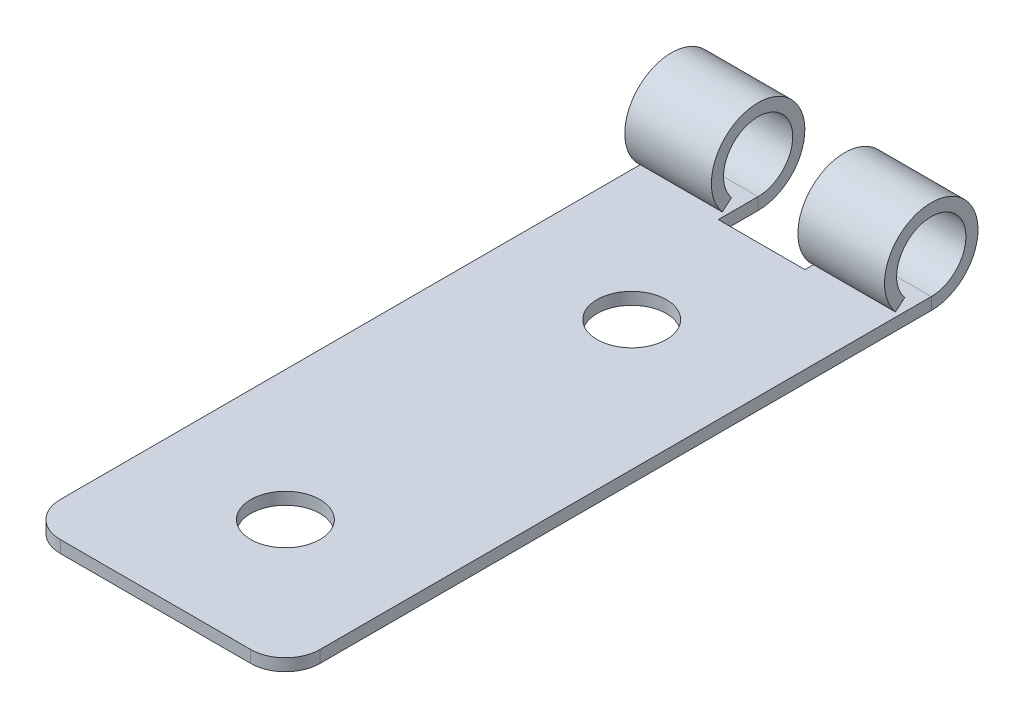
ISO-10303-21;
HEADER;
FILE_DESCRIPTION(('STEP AP214'),'2;1');
FILE_NAME('part.step','',(''),(''),'','','');
FILE_SCHEMA(('AUTOMOTIVE_DESIGN { 1 0 10303 214 1 1 1 1 }'));
ENDSEC;
DATA;
#1=APPLICATION_CONTEXT('core data for automotive mechanical design processes');
#2=APPLICATION_PROTOCOL_DEFINITION('international standard','automotive_design',2000,#1);
#3=PRODUCT_CONTEXT('',#1,'mechanical');
#4=PRODUCT('Part','Part','',(#3));
#5=PRODUCT_RELATED_PRODUCT_CATEGORY('part','',(#4));
#6=PRODUCT_DEFINITION_FORMATION('','',#4);
#7=PRODUCT_DEFINITION_CONTEXT('part definition',#1,'design');
#8=PRODUCT_DEFINITION('design','',#6,#7);
#9=PRODUCT_DEFINITION_SHAPE('','',#8);
#10=(LENGTH_UNIT() NAMED_UNIT(*) SI_UNIT(.MILLI.,.METRE.));
#11=(NAMED_UNIT(*) PLANE_ANGLE_UNIT() SI_UNIT($,.RADIAN.));
#12=(NAMED_UNIT(*) SI_UNIT($,.STERADIAN.) SOLID_ANGLE_UNIT());
#13=UNCERTAINTY_MEASURE_WITH_UNIT(LENGTH_MEASURE(1.E-05),#10,'distance_accuracy_value','');
#14=(GEOMETRIC_REPRESENTATION_CONTEXT(3) GLOBAL_UNCERTAINTY_ASSIGNED_CONTEXT((#13)) GLOBAL_UNIT_ASSIGNED_CONTEXT((#10,
#11,#12)) REPRESENTATION_CONTEXT('',''));
#15=CARTESIAN_POINT('',(0.,0.,0.));
#16=DIRECTION('',(0.,0.,1.));
#17=DIRECTION('',(1.,0.,0.));
#18=AXIS2_PLACEMENT_3D('',#15,#16,#17);
#19=CARTESIAN_POINT('',(10.,-0.7,0.));
#20=DIRECTION('',(-1.,0.,0.));
#21=DIRECTION('',(0.,0.,1.));
#22=AXIS2_PLACEMENT_3D('',#19,#20,#21);
#23=PLANE('',#22);
#24=DIRECTION('',(0.,0.,1.));
#25=VECTOR('',#24,1.);
#26=CARTESIAN_POINT('',(10.,0.,0.));
#27=LINE('',#26,#25);
#28=CARTESIAN_POINT('',(10.,0.,2.7));
#29=VERTEX_POINT('',#28);
#30=CARTESIAN_POINT('',(10.,0.,5.));
#31=VERTEX_POINT('',#30);
#32=EDGE_CURVE('E294',#29,#31,#27,.T.);
#33=ORIENTED_EDGE('',*,*,#32,.F.);
#34=DIRECTION('',(0.,-1.,0.));
#35=VECTOR('',#34,1.);
#36=CARTESIAN_POINT('',(10.,0.,2.7));
#37=LINE('',#36,#35);
#38=CARTESIAN_POINT('',(10.,-0.7,2.7));
#39=VERTEX_POINT('',#38);
#40=EDGE_CURVE('E172',#29,#39,#37,.T.);
#41=ORIENTED_EDGE('',*,*,#40,.T.);
#42=DIRECTION('',(0.,0.,1.));
#43=VECTOR('',#42,1.);
#44=CARTESIAN_POINT('',(10.,-0.7,0.));
#45=LINE('',#44,#43);
#46=CARTESIAN_POINT('',(10.,-0.7,5.));
#47=VERTEX_POINT('',#46);
#48=EDGE_CURVE('E148',#39,#47,#45,.T.);
#49=ORIENTED_EDGE('',*,*,#48,.T.);
#50=DIRECTION('',(0.,1.,0.));
#51=VECTOR('',#50,1.);
#52=CARTESIAN_POINT('',(10.,-0.7,5.));
#53=LINE('',#52,#51);
#54=EDGE_CURVE('E283',#47,#31,#53,.T.);
#55=ORIENTED_EDGE('',*,*,#54,.T.);
#56=EDGE_LOOP('',(#33,#41,#49,#55));
#57=FACE_BOUND('',#56,.T.);
#58=ADVANCED_FACE('F41',(#57),#23,.T.);
#59=CARTESIAN_POINT('',(0.,-0.7,0.));
#60=DIRECTION('',(-1.,0.,0.));
#61=DIRECTION('',(0.,0.,1.));
#62=AXIS2_PLACEMENT_3D('',#59,#60,#61);
#63=PLANE('',#62);
#64=DIRECTION('',(0.,0.,1.));
#65=VECTOR('',#64,1.);
#66=CARTESIAN_POINT('',(0.,-0.7,0.));
#67=LINE('',#66,#65);
#68=CARTESIAN_POINT('',(0.,-0.7,2.7));
#69=VERTEX_POINT('',#68);
#70=CARTESIAN_POINT('',(0.,-0.7,38.));
#71=VERTEX_POINT('',#70);
#72=EDGE_CURVE('E267',#69,#71,#67,.T.);
#73=ORIENTED_EDGE('',*,*,#72,.T.);
#74=DIRECTION('',(0.,1.,0.));
#75=VECTOR('',#74,1.);
#76=CARTESIAN_POINT('',(0.,-0.7,38.));
#77=LINE('',#76,#75);
#78=CARTESIAN_POINT('',(0.,0.,38.));
#79=VERTEX_POINT('',#78);
#80=EDGE_CURVE('E306',#71,#79,#77,.T.);
#81=ORIENTED_EDGE('',*,*,#80,.T.);
#82=DIRECTION('',(0.,0.,1.));
#83=VECTOR('',#82,1.);
#84=CARTESIAN_POINT('',(0.,0.,0.));
#85=LINE('',#84,#83);
#86=CARTESIAN_POINT('',(0.,0.,2.7));
#87=VERTEX_POINT('',#86);
#88=EDGE_CURVE('E266',#87,#79,#85,.T.);
#89=ORIENTED_EDGE('',*,*,#88,.F.);
#90=DIRECTION('',(0.,-1.,0.));
#91=VECTOR('',#90,1.);
#92=CARTESIAN_POINT('',(0.,0.,2.7));
#93=LINE('',#92,#91);
#94=EDGE_CURVE('E215',#87,#69,#93,.T.);
#95=ORIENTED_EDGE('',*,*,#94,.T.);
#96=EDGE_LOOP('',(#73,#81,#89,#95));
#97=FACE_BOUND('',#96,.T.);
#98=ADVANCED_FACE('F335',(#97),#63,.T.);
#99=CARTESIAN_POINT('',(5.,-0.7,5.));
#100=DIRECTION('',(1.,0.,0.));
#101=DIRECTION('',(0.,0.,-1.));
#102=AXIS2_PLACEMENT_3D('',#99,#100,#101);
#103=PLANE('',#102);
#104=DIRECTION('',(0.,-1.,0.));
#105=VECTOR('',#104,1.);
#106=CARTESIAN_POINT('',(5.,0.,2.7));
#107=LINE('',#106,#105);
#108=CARTESIAN_POINT('',(5.,0.,2.7));
#109=VERTEX_POINT('',#108);
#110=CARTESIAN_POINT('',(5.,-0.700000000000001,2.7));
#111=VERTEX_POINT('',#110);
#112=EDGE_CURVE('E238',#109,#111,#107,.T.);
#113=ORIENTED_EDGE('',*,*,#112,.F.);
#114=DIRECTION('',(0.,0.,-1.));
#115=VECTOR('',#114,1.);
#116=CARTESIAN_POINT('',(5.,0.,5.));
#117=LINE('',#116,#115);
#118=CARTESIAN_POINT('',(5.,0.,5.));
#119=VERTEX_POINT('',#118);
#120=EDGE_CURVE('E271',#119,#109,#117,.T.);
#121=ORIENTED_EDGE('',*,*,#120,.F.);
#122=DIRECTION('',(0.,1.,0.));
#123=VECTOR('',#122,1.);
#124=CARTESIAN_POINT('',(5.,-0.7,5.));
#125=LINE('',#124,#123);
#126=CARTESIAN_POINT('',(5.,-0.7,5.));
#127=VERTEX_POINT('',#126);
#128=EDGE_CURVE('E303',#127,#119,#125,.T.);
#129=ORIENTED_EDGE('',*,*,#128,.F.);
#130=DIRECTION('',(0.,0.,-1.));
#131=VECTOR('',#130,1.);
#132=CARTESIAN_POINT('',(5.,-0.7,5.));
#133=LINE('',#132,#131);
#134=EDGE_CURVE('E280',#127,#111,#133,.T.);
#135=ORIENTED_EDGE('',*,*,#134,.T.);
#136=EDGE_LOOP('',(#113,#121,#129,#135));
#137=FACE_BOUND('',#136,.T.);
#138=ADVANCED_FACE('F377',(#137),#103,.T.);
#139=CARTESIAN_POINT('',(10.,-0.7,5.));
#140=DIRECTION('',(0.,0.,-1.));
#141=DIRECTION('',(-1.,0.,0.));
#142=AXIS2_PLACEMENT_3D('',#139,#140,#141);
#143=PLANE('',#142);
#144=DIRECTION('',(-1.,0.,0.));
#145=VECTOR('',#144,1.);
#146=CARTESIAN_POINT('',(10.,0.,5.));
#147=LINE('',#146,#145);
#148=EDGE_CURVE('E297',#31,#119,#147,.T.);
#149=ORIENTED_EDGE('',*,*,#148,.F.);
#150=ORIENTED_EDGE('',*,*,#54,.F.);
#151=DIRECTION('',(-1.,0.,0.));
#152=VECTOR('',#151,1.);
#153=CARTESIAN_POINT('',(10.,-0.7,5.));
#154=LINE('',#153,#152);
#155=EDGE_CURVE('E276',#47,#127,#154,.T.);
#156=ORIENTED_EDGE('',*,*,#155,.T.);
#157=ORIENTED_EDGE('',*,*,#128,.T.);
#158=EDGE_LOOP('',(#149,#150,#156,#157));
#159=FACE_BOUND('',#158,.T.);
#160=ADVANCED_FACE('F381',(#159),#143,.T.);
#161=CARTESIAN_POINT('',(15.,-0.7,40.));
#162=DIRECTION('',(1.,0.,0.));
#163=DIRECTION('',(0.,0.,-1.));
#164=AXIS2_PLACEMENT_3D('',#161,#162,#163);
#165=PLANE('',#164);
#166=DIRECTION('',(0.,0.,-1.));
#167=VECTOR('',#166,1.);
#168=CARTESIAN_POINT('',(15.,0.,40.));
#169=LINE('',#168,#167);
#170=CARTESIAN_POINT('',(15.,0.,38.));
#171=VERTEX_POINT('',#170);
#172=CARTESIAN_POINT('',(15.,0.,2.7));
#173=VERTEX_POINT('',#172);
#174=EDGE_CURVE('E291',#171,#173,#169,.T.);
#175=ORIENTED_EDGE('',*,*,#174,.F.);
#176=DIRECTION('',(0.,1.,0.));
#177=VECTOR('',#176,1.);
#178=CARTESIAN_POINT('',(15.,-0.7,38.));
#179=LINE('',#178,#177);
#180=CARTESIAN_POINT('',(15.,-0.7,38.));
#181=VERTEX_POINT('',#180);
#182=EDGE_CURVE('E11',#171,#181,#179,.F.);
#183=ORIENTED_EDGE('',*,*,#182,.T.);
#184=DIRECTION('',(0.,0.,-1.));
#185=VECTOR('',#184,1.);
#186=CARTESIAN_POINT('',(15.,-0.7,40.));
#187=LINE('',#186,#185);
#188=CARTESIAN_POINT('',(15.,-0.700000000000002,2.7));
#189=VERTEX_POINT('',#188);
#190=EDGE_CURVE('E141',#181,#189,#187,.T.);
#191=ORIENTED_EDGE('',*,*,#190,.T.);
#192=DIRECTION('',(0.,-1.,0.));
#193=VECTOR('',#192,1.);
#194=CARTESIAN_POINT('',(15.,0.,2.7));
#195=LINE('',#194,#193);
#196=EDGE_CURVE('E145',#173,#189,#195,.T.);
#197=ORIENTED_EDGE('',*,*,#196,.F.);
#198=EDGE_LOOP('',(#175,#183,#191,#197));
#199=FACE_BOUND('',#198,.T.);
#200=ADVANCED_FACE('F143',(#199),#165,.T.);
#201=CARTESIAN_POINT('',(0.,-0.7,40.));
#202=DIRECTION('',(0.,0.,1.));
#203=DIRECTION('',(1.,0.,0.));
#204=AXIS2_PLACEMENT_3D('',#201,#202,#203);
#205=PLANE('',#204);
#206=DIRECTION('',(1.,0.,0.));
#207=VECTOR('',#206,1.);
#208=CARTESIAN_POINT('',(0.,0.,40.));
#209=LINE('',#208,#207);
#210=CARTESIAN_POINT('',(2.,0.,40.));
#211=VERTEX_POINT('',#210);
#212=CARTESIAN_POINT('',(13.,0.,40.));
#213=VERTEX_POINT('',#212);
#214=EDGE_CURVE('E287',#211,#213,#209,.T.);
#215=ORIENTED_EDGE('',*,*,#214,.F.);
#216=DIRECTION('',(0.,1.,0.));
#217=VECTOR('',#216,1.);
#218=CARTESIAN_POINT('',(2.,-0.7,40.));
#219=LINE('',#218,#217);
#220=CARTESIAN_POINT('',(2.,-0.7,40.));
#221=VERTEX_POINT('',#220);
#222=EDGE_CURVE('E323',#211,#221,#219,.F.);
#223=ORIENTED_EDGE('',*,*,#222,.T.);
#224=DIRECTION('',(1.,0.,0.));
#225=VECTOR('',#224,1.);
#226=CARTESIAN_POINT('',(0.,-0.7,40.));
#227=LINE('',#226,#225);
#228=CARTESIAN_POINT('',(13.,-0.7,40.));
#229=VERTEX_POINT('',#228);
#230=EDGE_CURVE('E149',#221,#229,#227,.T.);
#231=ORIENTED_EDGE('',*,*,#230,.T.);
#232=DIRECTION('',(0.,1.,0.));
#233=VECTOR('',#232,1.);
#234=CARTESIAN_POINT('',(13.,-0.7,40.));
#235=LINE('',#234,#233);
#236=EDGE_CURVE('E319',#229,#213,#235,.T.);
#237=ORIENTED_EDGE('',*,*,#236,.T.);
#238=EDGE_LOOP('',(#215,#223,#231,#237));
#239=FACE_BOUND('',#238,.T.);
#240=ADVANCED_FACE('F344',(#239),#205,.T.);
#241=CARTESIAN_POINT('',(0.,-0.7,0.));
#242=DIRECTION('',(0.,1.,0.));
#243=DIRECTION('',(0.,0.,1.));
#244=AXIS2_PLACEMENT_3D('',#241,#242,#243);
#245=PLANE('',#244);
#246=CARTESIAN_POINT('',(7.50000000000001,-0.699999999999999,12.5));
#247=DIRECTION('',(0.,1.,0.));
#248=DIRECTION('',(0.,0.,1.));
#249=AXIS2_PLACEMENT_3D('',#246,#247,#248);
#250=CIRCLE('',#249,2.);
#251=CARTESIAN_POINT('',(7.50000000000001,-0.699999999999999,14.5));
#252=VERTEX_POINT('',#251);
#253=EDGE_CURVE('E262',#252,#252,#250,.T.);
#254=ORIENTED_EDGE('',*,*,#253,.T.);
#255=EDGE_LOOP('',(#254));
#256=FACE_BOUND('',#255,.T.);
#257=CARTESIAN_POINT('',(7.50000000000001,-0.699999999999999,32.5));
#258=DIRECTION('',(0.,1.,0.));
#259=DIRECTION('',(0.,0.,1.));
#260=AXIS2_PLACEMENT_3D('',#257,#258,#259);
#261=CIRCLE('',#260,2.);
#262=CARTESIAN_POINT('',(7.50000000000001,-0.699999999999999,34.5));
#263=VERTEX_POINT('',#262);
#264=EDGE_CURVE('E255',#263,#263,#261,.T.);
#265=ORIENTED_EDGE('',*,*,#264,.T.);
#266=EDGE_LOOP('',(#265));
#267=FACE_BOUND('',#266,.T.);
#268=ORIENTED_EDGE('',*,*,#230,.F.);
#269=CARTESIAN_POINT('',(2.,-0.7,38.));
#270=DIRECTION('',(0.,1.,0.));
#271=DIRECTION('',(0.,0.,1.));
#272=AXIS2_PLACEMENT_3D('',#269,#270,#271);
#273=CIRCLE('',#272,2.);
#274=EDGE_CURVE('E50',#221,#71,#273,.F.);
#275=ORIENTED_EDGE('',*,*,#274,.T.);
#276=ORIENTED_EDGE('',*,*,#72,.F.);
#277=DIRECTION('',(-1.,0.,0.));
#278=VECTOR('',#277,1.);
#279=CARTESIAN_POINT('',(0.,-0.700000000000001,2.7));
#280=LINE('',#279,#278);
#281=EDGE_CURVE('E206',#69,#111,#280,.F.);
#282=ORIENTED_EDGE('',*,*,#281,.T.);
#283=ORIENTED_EDGE('',*,*,#134,.F.);
#284=ORIENTED_EDGE('',*,*,#155,.F.);
#285=ORIENTED_EDGE('',*,*,#48,.F.);
#286=DIRECTION('',(-1.,0.,0.));
#287=VECTOR('',#286,1.);
#288=CARTESIAN_POINT('',(10.,-0.700000000000002,2.7));
#289=LINE('',#288,#287);
#290=EDGE_CURVE('E153',#39,#189,#289,.F.);
#291=ORIENTED_EDGE('',*,*,#290,.T.);
#292=ORIENTED_EDGE('',*,*,#190,.F.);
#293=CARTESIAN_POINT('',(13.,-0.7,38.));
#294=DIRECTION('',(0.,1.,0.));
#295=DIRECTION('',(0.,0.,1.));
#296=AXIS2_PLACEMENT_3D('',#293,#294,#295);
#297=CIRCLE('',#296,2.);
#298=EDGE_CURVE('E62',#181,#229,#297,.F.);
#299=ORIENTED_EDGE('',*,*,#298,.T.);
#300=EDGE_LOOP('',(#268,#275,#276,#282,#283,#284,#285,#291,#292,#299));
#301=FACE_BOUND('',#300,.T.);
#302=ADVANCED_FACE('F154',(#256,#267,#301),#245,.F.);
#303=CARTESIAN_POINT('',(0.,0.,0.));
#304=DIRECTION('',(0.,1.,0.));
#305=DIRECTION('',(0.,0.,1.));
#306=AXIS2_PLACEMENT_3D('',#303,#304,#305);
#307=PLANE('',#306);
#308=ORIENTED_EDGE('',*,*,#88,.T.);
#309=CARTESIAN_POINT('',(2.,0.,38.));
#310=DIRECTION('',(0.,1.,0.));
#311=DIRECTION('',(0.,0.,1.));
#312=AXIS2_PLACEMENT_3D('',#309,#310,#311);
#313=CIRCLE('',#312,2.);
#314=EDGE_CURVE('E316',#79,#211,#313,.T.);
#315=ORIENTED_EDGE('',*,*,#314,.T.);
#316=ORIENTED_EDGE('',*,*,#214,.T.);
#317=CARTESIAN_POINT('',(13.,0.,38.));
#318=DIRECTION('',(0.,1.,0.));
#319=DIRECTION('',(0.,0.,1.));
#320=AXIS2_PLACEMENT_3D('',#317,#318,#319);
#321=CIRCLE('',#320,2.);
#322=EDGE_CURVE('E313',#213,#171,#321,.T.);
#323=ORIENTED_EDGE('',*,*,#322,.T.);
#324=ORIENTED_EDGE('',*,*,#174,.T.);
#325=DIRECTION('',(-1.,0.,0.));
#326=VECTOR('',#325,1.);
#327=CARTESIAN_POINT('',(10.,0.,2.7));
#328=LINE('',#327,#326);
#329=EDGE_CURVE('E189',#29,#173,#328,.F.);
#330=ORIENTED_EDGE('',*,*,#329,.F.);
#331=ORIENTED_EDGE('',*,*,#32,.T.);
#332=ORIENTED_EDGE('',*,*,#148,.T.);
#333=ORIENTED_EDGE('',*,*,#120,.T.);
#334=DIRECTION('',(-1.,0.,0.));
#335=VECTOR('',#334,1.);
#336=CARTESIAN_POINT('',(0.,0.,2.7));
#337=LINE('',#336,#335);
#338=EDGE_CURVE('E227',#87,#109,#337,.F.);
#339=ORIENTED_EDGE('',*,*,#338,.F.);
#340=EDGE_LOOP('',(#308,#315,#316,#323,#324,#330,#331,#332,#333,#339));
#341=FACE_BOUND('',#340,.T.);
#342=CARTESIAN_POINT('',(7.50000000000001,0.,12.5));
#343=DIRECTION('',(0.,1.,0.));
#344=DIRECTION('',(0.,0.,1.));
#345=AXIS2_PLACEMENT_3D('',#342,#343,#344);
#346=CIRCLE('',#345,2.);
#347=CARTESIAN_POINT('',(7.50000000000001,0.,14.5));
#348=VERTEX_POINT('',#347);
#349=EDGE_CURVE('E251',#348,#348,#346,.T.);
#350=ORIENTED_EDGE('',*,*,#349,.F.);
#351=EDGE_LOOP('',(#350));
#352=FACE_BOUND('',#351,.T.);
#353=CARTESIAN_POINT('',(7.50000000000001,0.,32.5));
#354=DIRECTION('',(0.,1.,0.));
#355=DIRECTION('',(0.,0.,-1.));
#356=AXIS2_PLACEMENT_3D('',#353,#354,#355);
#357=CIRCLE('',#356,2.);
#358=CARTESIAN_POINT('',(7.50000000000001,0.,30.5));
#359=VERTEX_POINT('',#358);
#360=EDGE_CURVE('E248',#359,#359,#357,.T.);
#361=ORIENTED_EDGE('',*,*,#360,.F.);
#362=EDGE_LOOP('',(#361));
#363=FACE_BOUND('',#362,.T.);
#364=ADVANCED_FACE('F341',(#341,#352,#363),#307,.T.);
#365=CARTESIAN_POINT('',(7.50000000000001,-10.,32.5));
#366=DIRECTION('',(0.,1.,0.));
#367=DIRECTION('',(0.,0.,1.));
#368=AXIS2_PLACEMENT_3D('',#365,#366,#367);
#369=CYLINDRICAL_SURFACE('',#368,2.);
#370=ORIENTED_EDGE('',*,*,#360,.T.);
#371=EDGE_LOOP('',(#370));
#372=FACE_BOUND('',#371,.T.);
#373=ORIENTED_EDGE('',*,*,#264,.F.);
#374=EDGE_LOOP('',(#373));
#375=FACE_BOUND('',#374,.T.);
#376=ADVANCED_FACE('F420',(#372,#375),#369,.F.);
#377=CARTESIAN_POINT('',(7.50000000000001,-10.,12.5));
#378=DIRECTION('',(0.,1.,0.));
#379=DIRECTION('',(0.,0.,1.));
#380=AXIS2_PLACEMENT_3D('',#377,#378,#379);
#381=CYLINDRICAL_SURFACE('',#380,2.);
#382=ORIENTED_EDGE('',*,*,#349,.T.);
#383=EDGE_LOOP('',(#382));
#384=FACE_BOUND('',#383,.T.);
#385=ORIENTED_EDGE('',*,*,#253,.F.);
#386=EDGE_LOOP('',(#385));
#387=FACE_BOUND('',#386,.T.);
#388=ADVANCED_FACE('F413',(#384,#387),#381,.F.);
#389=CARTESIAN_POINT('',(2.5,0.714424780626909,4.23208888623795));
#390=DIRECTION('',(0.,0.766044443118973,0.642787609686545));
#391=DIRECTION('',(-1.,0.,0.));
#392=AXIS2_PLACEMENT_3D('',#389,#390,#391);
#393=PLANE('',#392);
#394=DIRECTION('',(0.,-0.642787609686545,0.766044443118973));
#395=VECTOR('',#394,1.);
#396=CARTESIAN_POINT('',(0.,0.714424780626909,4.23208888623795));
#397=LINE('',#396,#395);
#398=CARTESIAN_POINT('',(0.,0.714424780626909,4.23208888623795));
#399=VERTEX_POINT('',#398);
#400=CARTESIAN_POINT('',(0.,0.264473453846327,4.76831999642123));
#401=VERTEX_POINT('',#400);
#402=EDGE_CURVE('E245',#399,#401,#397,.T.);
#403=ORIENTED_EDGE('',*,*,#402,.F.);
#404=DIRECTION('',(-1.,0.,0.));
#405=VECTOR('',#404,1.);
#406=CARTESIAN_POINT('',(0.,0.714424780626909,4.23208888623795));
#407=LINE('',#406,#405);
#408=CARTESIAN_POINT('',(5.,0.714424780626909,4.23208888623795));
#409=VERTEX_POINT('',#408);
#410=EDGE_CURVE('E204',#409,#399,#407,.T.);
#411=ORIENTED_EDGE('',*,*,#410,.F.);
#412=DIRECTION('',(0.,-0.642787609686545,0.766044443118973));
#413=VECTOR('',#412,1.);
#414=CARTESIAN_POINT('',(5.,0.714424780626909,4.23208888623795));
#415=LINE('',#414,#413);
#416=CARTESIAN_POINT('',(5.,0.264473453846327,4.76831999642123));
#417=VERTEX_POINT('',#416);
#418=EDGE_CURVE('E242',#409,#417,#415,.T.);
#419=ORIENTED_EDGE('',*,*,#418,.T.);
#420=DIRECTION('',(-1.,0.,0.));
#421=VECTOR('',#420,1.);
#422=CARTESIAN_POINT('',(0.,0.264473453846327,4.76831999642123));
#423=LINE('',#422,#421);
#424=EDGE_CURVE('E216',#417,#401,#423,.T.);
#425=ORIENTED_EDGE('',*,*,#424,.T.);
#426=EDGE_LOOP('',(#403,#411,#419,#425));
#427=FACE_BOUND('',#426,.T.);
#428=ADVANCED_FACE('F409',(#427),#393,.F.);
#429=CARTESIAN_POINT('',(5.,2.,2.7));
#430=DIRECTION('',(1.,0.,0.));
#431=DIRECTION('',(0.,0.,-1.));
#432=AXIS2_PLACEMENT_3D('',#429,#430,#431);
#433=PLANE('',#432);
#434=ORIENTED_EDGE('',*,*,#418,.F.);
#435=CARTESIAN_POINT('',(5.,2.,2.7));
#436=DIRECTION('',(-1.,0.,0.));
#437=DIRECTION('',(0.,0.,1.));
#438=AXIS2_PLACEMENT_3D('',#435,#436,#437);
#439=CIRCLE('',#438,2.);
#440=EDGE_CURVE('E220',#109,#409,#439,.F.);
#441=ORIENTED_EDGE('',*,*,#440,.F.);
#442=ORIENTED_EDGE('',*,*,#112,.T.);
#443=CARTESIAN_POINT('',(5.,2.,2.7));
#444=DIRECTION('',(-1.,0.,0.));
#445=DIRECTION('',(0.,0.,1.));
#446=AXIS2_PLACEMENT_3D('',#443,#444,#445);
#447=CIRCLE('',#446,2.7);
#448=EDGE_CURVE('E210',#111,#417,#447,.F.);
#449=ORIENTED_EDGE('',*,*,#448,.T.);
#450=EDGE_LOOP('',(#434,#441,#442,#449));
#451=FACE_BOUND('',#450,.T.);
#452=ADVANCED_FACE('F406',(#451),#433,.T.);
#453=CARTESIAN_POINT('',(0.,2.,2.7));
#454=DIRECTION('',(1.,0.,0.));
#455=DIRECTION('',(0.,0.,-1.));
#456=AXIS2_PLACEMENT_3D('',#453,#454,#455);
#457=PLANE('',#456);
#458=CARTESIAN_POINT('',(0.,2.,2.7));
#459=DIRECTION('',(-1.,0.,0.));
#460=DIRECTION('',(0.,0.,1.));
#461=AXIS2_PLACEMENT_3D('',#458,#459,#460);
#462=CIRCLE('',#461,2.);
#463=EDGE_CURVE('E231',#399,#87,#462,.T.);
#464=ORIENTED_EDGE('',*,*,#463,.F.);
#465=ORIENTED_EDGE('',*,*,#402,.T.);
#466=CARTESIAN_POINT('',(0.,2.,2.7));
#467=DIRECTION('',(-1.,0.,0.));
#468=DIRECTION('',(0.,0.,1.));
#469=AXIS2_PLACEMENT_3D('',#466,#467,#468);
#470=CIRCLE('',#469,2.7);
#471=EDGE_CURVE('E211',#401,#69,#470,.T.);
#472=ORIENTED_EDGE('',*,*,#471,.T.);
#473=ORIENTED_EDGE('',*,*,#94,.F.);
#474=EDGE_LOOP('',(#464,#465,#472,#473));
#475=FACE_BOUND('',#474,.T.);
#476=ADVANCED_FACE('F403',(#475),#457,.F.);
#477=CARTESIAN_POINT('',(0.,2.,2.7));
#478=DIRECTION('',(-1.,0.,0.));
#479=DIRECTION('',(0.,-0.642787609686545,0.766044443118973));
#480=AXIS2_PLACEMENT_3D('',#477,#478,#479);
#481=CYLINDRICAL_SURFACE('',#480,2.7);
#482=ORIENTED_EDGE('',*,*,#281,.F.);
#483=ORIENTED_EDGE('',*,*,#471,.F.);
#484=ORIENTED_EDGE('',*,*,#424,.F.);
#485=ORIENTED_EDGE('',*,*,#448,.F.);
#486=EDGE_LOOP('',(#482,#483,#484,#485));
#487=FACE_BOUND('',#486,.T.);
#488=ADVANCED_FACE('F368',(#487),#481,.T.);
#489=CARTESIAN_POINT('',(0.,2.,2.7));
#490=DIRECTION('',(-1.,0.,0.));
#491=DIRECTION('',(0.,-0.642787609686545,0.766044443118973));
#492=AXIS2_PLACEMENT_3D('',#489,#490,#491);
#493=CYLINDRICAL_SURFACE('',#492,2.);
#494=ORIENTED_EDGE('',*,*,#338,.T.);
#495=ORIENTED_EDGE('',*,*,#440,.T.);
#496=ORIENTED_EDGE('',*,*,#410,.T.);
#497=ORIENTED_EDGE('',*,*,#463,.T.);
#498=EDGE_LOOP('',(#494,#495,#496,#497));
#499=FACE_BOUND('',#498,.T.);
#500=ADVANCED_FACE('F361',(#499),#493,.F.);
#501=CARTESIAN_POINT('',(12.5,0.714424780626909,4.23208888623795));
#502=DIRECTION('',(0.,0.766044443118973,0.642787609686545));
#503=DIRECTION('',(-1.,0.,0.));
#504=AXIS2_PLACEMENT_3D('',#501,#502,#503);
#505=PLANE('',#504);
#506=DIRECTION('',(0.,-0.642787609686545,0.766044443118973));
#507=VECTOR('',#506,1.);
#508=CARTESIAN_POINT('',(10.,0.714424780626909,4.23208888623795));
#509=LINE('',#508,#507);
#510=CARTESIAN_POINT('',(10.,0.714424780626909,4.23208888623795));
#511=VERTEX_POINT('',#510);
#512=CARTESIAN_POINT('',(10.,0.264473453846327,4.76831999642123));
#513=VERTEX_POINT('',#512);
#514=EDGE_CURVE('E202',#511,#513,#509,.T.);
#515=ORIENTED_EDGE('',*,*,#514,.F.);
#516=DIRECTION('',(-1.,0.,0.));
#517=VECTOR('',#516,1.);
#518=CARTESIAN_POINT('',(10.,0.714424780626909,4.23208888623795));
#519=LINE('',#518,#517);
#520=CARTESIAN_POINT('',(15.,0.714424780626909,4.23208888623795));
#521=VERTEX_POINT('',#520);
#522=EDGE_CURVE('E196',#521,#511,#519,.T.);
#523=ORIENTED_EDGE('',*,*,#522,.F.);
#524=DIRECTION('',(0.,-0.642787609686545,0.766044443118973));
#525=VECTOR('',#524,1.);
#526=CARTESIAN_POINT('',(15.,0.714424780626909,4.23208888623795));
#527=LINE('',#526,#525);
#528=CARTESIAN_POINT('',(15.,0.264473453846327,4.76831999642123));
#529=VERTEX_POINT('',#528);
#530=EDGE_CURVE('E171',#521,#529,#527,.T.);
#531=ORIENTED_EDGE('',*,*,#530,.T.);
#532=DIRECTION('',(-1.,0.,0.));
#533=VECTOR('',#532,1.);
#534=CARTESIAN_POINT('',(10.,0.264473453846327,4.76831999642123));
#535=LINE('',#534,#533);
#536=EDGE_CURVE('E177',#529,#513,#535,.T.);
#537=ORIENTED_EDGE('',*,*,#536,.T.);
#538=EDGE_LOOP('',(#515,#523,#531,#537));
#539=FACE_BOUND('',#538,.T.);
#540=ADVANCED_FACE('F359',(#539),#505,.F.);
#541=CARTESIAN_POINT('',(15.,2.,2.7));
#542=DIRECTION('',(1.,0.,0.));
#543=DIRECTION('',(0.,0.,-1.));
#544=AXIS2_PLACEMENT_3D('',#541,#542,#543);
#545=PLANE('',#544);
#546=ORIENTED_EDGE('',*,*,#530,.F.);
#547=CARTESIAN_POINT('',(15.,2.,2.7));
#548=DIRECTION('',(-1.,0.,0.));
#549=DIRECTION('',(0.,0.,1.));
#550=AXIS2_PLACEMENT_3D('',#547,#548,#549);
#551=CIRCLE('',#550,2.);
#552=EDGE_CURVE('E169',#173,#521,#551,.F.);
#553=ORIENTED_EDGE('',*,*,#552,.F.);
#554=ORIENTED_EDGE('',*,*,#196,.T.);
#555=CARTESIAN_POINT('',(15.,2.,2.7));
#556=DIRECTION('',(-1.,0.,0.));
#557=DIRECTION('',(0.,0.,1.));
#558=AXIS2_PLACEMENT_3D('',#555,#556,#557);
#559=CIRCLE('',#558,2.7);
#560=EDGE_CURVE('E161',#189,#529,#559,.F.);
#561=ORIENTED_EDGE('',*,*,#560,.T.);
#562=EDGE_LOOP('',(#546,#553,#554,#561));
#563=FACE_BOUND('',#562,.T.);
#564=ADVANCED_FACE('F167',(#563),#545,.T.);
#565=CARTESIAN_POINT('',(10.,2.,2.7));
#566=DIRECTION('',(1.,0.,0.));
#567=DIRECTION('',(0.,0.,-1.));
#568=AXIS2_PLACEMENT_3D('',#565,#566,#567);
#569=PLANE('',#568);
#570=CARTESIAN_POINT('',(10.,2.,2.7));
#571=DIRECTION('',(-1.,0.,0.));
#572=DIRECTION('',(0.,0.,1.));
#573=AXIS2_PLACEMENT_3D('',#570,#571,#572);
#574=CIRCLE('',#573,2.);
#575=EDGE_CURVE('E192',#511,#29,#574,.T.);
#576=ORIENTED_EDGE('',*,*,#575,.F.);
#577=ORIENTED_EDGE('',*,*,#514,.T.);
#578=CARTESIAN_POINT('',(10.,2.,2.7));
#579=DIRECTION('',(-1.,0.,0.));
#580=DIRECTION('',(0.,0.,1.));
#581=AXIS2_PLACEMENT_3D('',#578,#579,#580);
#582=CIRCLE('',#581,2.7);
#583=EDGE_CURVE('E162',#513,#39,#582,.T.);
#584=ORIENTED_EDGE('',*,*,#583,.T.);
#585=ORIENTED_EDGE('',*,*,#40,.F.);
#586=EDGE_LOOP('',(#576,#577,#584,#585));
#587=FACE_BOUND('',#586,.T.);
#588=ADVANCED_FACE('F355',(#587),#569,.F.);
#589=CARTESIAN_POINT('',(10.,2.,2.7));
#590=DIRECTION('',(-1.,0.,0.));
#591=DIRECTION('',(0.,-0.642787609686545,0.766044443118973));
#592=AXIS2_PLACEMENT_3D('',#589,#590,#591);
#593=CYLINDRICAL_SURFACE('',#592,2.7);
#594=ORIENTED_EDGE('',*,*,#290,.F.);
#595=ORIENTED_EDGE('',*,*,#583,.F.);
#596=ORIENTED_EDGE('',*,*,#536,.F.);
#597=ORIENTED_EDGE('',*,*,#560,.F.);
#598=EDGE_LOOP('',(#594,#595,#596,#597));
#599=FACE_BOUND('',#598,.T.);
#600=ADVANCED_FACE('F175',(#599),#593,.T.);
#601=CARTESIAN_POINT('',(10.,2.,2.7));
#602=DIRECTION('',(-1.,0.,0.));
#603=DIRECTION('',(0.,-0.642787609686545,0.766044443118973));
#604=AXIS2_PLACEMENT_3D('',#601,#602,#603);
#605=CYLINDRICAL_SURFACE('',#604,2.);
#606=ORIENTED_EDGE('',*,*,#329,.T.);
#607=ORIENTED_EDGE('',*,*,#552,.T.);
#608=ORIENTED_EDGE('',*,*,#522,.T.);
#609=ORIENTED_EDGE('',*,*,#575,.T.);
#610=EDGE_LOOP('',(#606,#607,#608,#609));
#611=FACE_BOUND('',#610,.T.);
#612=ADVANCED_FACE('F356',(#611),#605,.F.);
#613=CARTESIAN_POINT('',(2.,-0.7,38.));
#614=DIRECTION('',(0.,1.,0.));
#615=DIRECTION('',(0.,0.,1.));
#616=AXIS2_PLACEMENT_3D('',#613,#614,#615);
#617=CYLINDRICAL_SURFACE('',#616,2.);
#618=ORIENTED_EDGE('',*,*,#274,.F.);
#619=ORIENTED_EDGE('',*,*,#222,.F.);
#620=ORIENTED_EDGE('',*,*,#314,.F.);
#621=ORIENTED_EDGE('',*,*,#80,.F.);
#622=EDGE_LOOP('',(#618,#619,#620,#621));
#623=FACE_BOUND('',#622,.T.);
#624=ADVANCED_FACE('F338',(#623),#617,.T.);
#625=CARTESIAN_POINT('',(13.,-0.7,38.));
#626=DIRECTION('',(0.,1.,0.));
#627=DIRECTION('',(0.,0.,1.));
#628=AXIS2_PLACEMENT_3D('',#625,#626,#627);
#629=CYLINDRICAL_SURFACE('',#628,2.);
#630=ORIENTED_EDGE('',*,*,#298,.F.);
#631=ORIENTED_EDGE('',*,*,#182,.F.);
#632=ORIENTED_EDGE('',*,*,#322,.F.);
#633=ORIENTED_EDGE('',*,*,#236,.F.);
#634=EDGE_LOOP('',(#630,#631,#632,#633));
#635=FACE_BOUND('',#634,.T.);
#636=ADVANCED_FACE('F43',(#635),#629,.T.);
#637=CLOSED_SHELL('',(#58,#98,#138,#160,#200,#240,#302,#364,#376,#388,#428,#452,#476,#488,#500,
#540,#564,#588,#600,#612,#624,#636));
#638=MANIFOLD_SOLID_BREP('B2',#637);
#639=ADVANCED_BREP_SHAPE_REPRESENTATION('',(#18,#638),#14);
#640=SHAPE_DEFINITION_REPRESENTATION(#9,#639);
ENDSEC;
END-ISO-10303-21;
